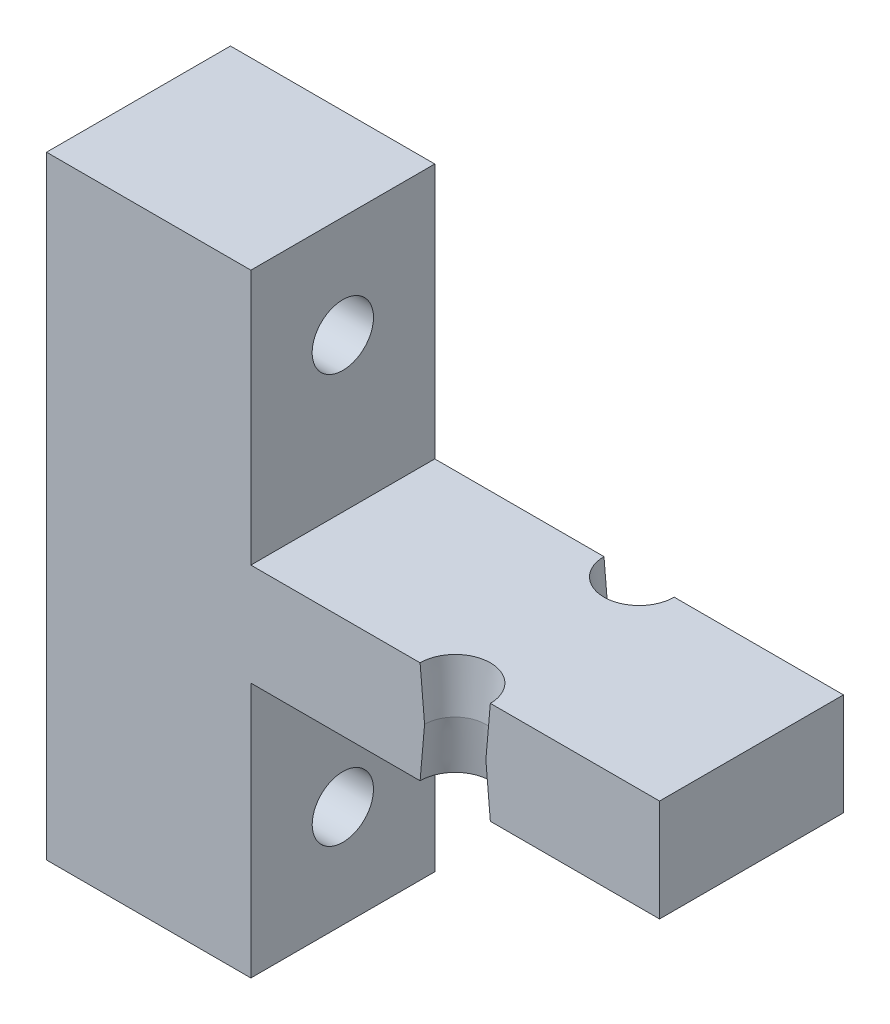
ISO-10303-21;
HEADER;
FILE_DESCRIPTION(('STEP AP214'),'2;1');
FILE_NAME('part.step','',(''),(''),'','','');
FILE_SCHEMA(('AUTOMOTIVE_DESIGN { 1 0 10303 214 1 1 1 1 }'));
ENDSEC;
DATA;
#1=APPLICATION_CONTEXT('core data for automotive mechanical design processes');
#2=APPLICATION_PROTOCOL_DEFINITION('international standard','automotive_design',2000,#1);
#3=PRODUCT_CONTEXT('',#1,'mechanical');
#4=PRODUCT('Part','Part','',(#3));
#5=PRODUCT_RELATED_PRODUCT_CATEGORY('part','',(#4));
#6=PRODUCT_DEFINITION_FORMATION('','',#4);
#7=PRODUCT_DEFINITION_CONTEXT('part definition',#1,'design');
#8=PRODUCT_DEFINITION('design','',#6,#7);
#9=PRODUCT_DEFINITION_SHAPE('','',#8);
#10=(LENGTH_UNIT() NAMED_UNIT(*) SI_UNIT(.MILLI.,.METRE.));
#11=(NAMED_UNIT(*) PLANE_ANGLE_UNIT() SI_UNIT($,.RADIAN.));
#12=(NAMED_UNIT(*) SI_UNIT($,.STERADIAN.) SOLID_ANGLE_UNIT());
#13=UNCERTAINTY_MEASURE_WITH_UNIT(LENGTH_MEASURE(1.E-05),#10,'distance_accuracy_value','');
#14=(GEOMETRIC_REPRESENTATION_CONTEXT(3) GLOBAL_UNCERTAINTY_ASSIGNED_CONTEXT((#13)) GLOBAL_UNIT_ASSIGNED_CONTEXT((#10,
#11,#12)) REPRESENTATION_CONTEXT('',''));
#15=CARTESIAN_POINT('',(0.,0.,0.));
#16=DIRECTION('',(0.,0.,1.));
#17=DIRECTION('',(1.,0.,0.));
#18=AXIS2_PLACEMENT_3D('',#15,#16,#17);
#19=CARTESIAN_POINT('',(0.,30.,9.));
#20=DIRECTION('',(0.,0.,-1.));
#21=DIRECTION('',(-1.,0.,0.));
#22=AXIS2_PLACEMENT_3D('',#19,#20,#21);
#23=PLANE('',#22);
#24=DIRECTION('',(0.0871557427476582,-0.996194698091746,0.));
#25=VECTOR('',#24,1.);
#26=CARTESIAN_POINT('',(20.,32.145078454142,9.));
#27=LINE('',#26,#25);
#28=CARTESIAN_POINT('',(21.7187216588148,12.5,9.00000000000001));
#29=VERTEX_POINT('',#28);
#30=CARTESIAN_POINT('',(21.5,15.,9.00000000000001));
#31=VERTEX_POINT('',#30);
#32=EDGE_CURVE('E141',#29,#31,#27,.F.);
#33=ORIENTED_EDGE('',*,*,#32,.F.);
#34=DIRECTION('',(-1.,0.,0.));
#35=VECTOR('',#34,1.);
#36=CARTESIAN_POINT('',(30.,12.5,9.00000000000001));
#37=LINE('',#36,#35);
#38=CARTESIAN_POINT('',(30.,12.5,9.00000000000001));
#39=VERTEX_POINT('',#38);
#40=EDGE_CURVE('E213',#39,#29,#37,.T.);
#41=ORIENTED_EDGE('',*,*,#40,.F.);
#42=DIRECTION('',(0.,-1.,0.));
#43=VECTOR('',#42,1.);
#44=CARTESIAN_POINT('',(30.,17.5,9.00000000000001));
#45=LINE('',#44,#43);
#46=CARTESIAN_POINT('',(30.,17.5,9.00000000000001));
#47=VERTEX_POINT('',#46);
#48=EDGE_CURVE('E188',#47,#39,#45,.T.);
#49=ORIENTED_EDGE('',*,*,#48,.F.);
#50=DIRECTION('',(-1.,0.,0.));
#51=VECTOR('',#50,1.);
#52=CARTESIAN_POINT('',(30.,17.5,9.00000000000001));
#53=LINE('',#52,#51);
#54=CARTESIAN_POINT('',(21.7187216588148,17.5,9.00000000000001));
#55=VERTEX_POINT('',#54);
#56=EDGE_CURVE('E159',#47,#55,#53,.T.);
#57=ORIENTED_EDGE('',*,*,#56,.T.);
#58=DIRECTION('',(-0.0871557427476582,-0.996194698091746,0.));
#59=VECTOR('',#58,1.);
#60=CARTESIAN_POINT('',(20.,-2.14507845414202,9.));
#61=LINE('',#60,#59);
#62=EDGE_CURVE('E54',#55,#31,#61,.T.);
#63=ORIENTED_EDGE('',*,*,#62,.T.);
#64=EDGE_LOOP('',(#33,#41,#49,#57,#63));
#65=FACE_BOUND('',#64,.T.);
#66=ADVANCED_FACE('F39',(#65),#23,.F.);
#67=DIRECTION('',(0.0871557427476582,0.996194698091746,0.));
#68=VECTOR('',#67,1.);
#69=CARTESIAN_POINT('',(20.,32.145078454142,9.));
#70=LINE('',#69,#68);
#71=CARTESIAN_POINT('',(18.5,15.,9.00000000000001));
#72=VERTEX_POINT('',#71);
#73=CARTESIAN_POINT('',(18.2812783411852,12.5,9.00000000000001));
#74=VERTEX_POINT('',#73);
#75=EDGE_CURVE('E150',#72,#74,#70,.F.);
#76=ORIENTED_EDGE('',*,*,#75,.F.);
#77=DIRECTION('',(-0.0871557427476582,0.996194698091746,0.));
#78=VECTOR('',#77,1.);
#79=CARTESIAN_POINT('',(20.,-2.14507845414202,9.));
#80=LINE('',#79,#78);
#81=CARTESIAN_POINT('',(18.2812783411852,17.5,9.00000000000001));
#82=VERTEX_POINT('',#81);
#83=EDGE_CURVE('E154',#72,#82,#80,.T.);
#84=ORIENTED_EDGE('',*,*,#83,.T.);
#85=CARTESIAN_POINT('',(10.,17.5,9.));
#86=VERTEX_POINT('',#85);
#87=EDGE_CURVE('E198',#82,#86,#53,.T.);
#88=ORIENTED_EDGE('',*,*,#87,.T.);
#89=DIRECTION('',(0.,-1.,0.));
#90=VECTOR('',#89,1.);
#91=CARTESIAN_POINT('',(10.,30.,9.));
#92=LINE('',#91,#90);
#93=CARTESIAN_POINT('',(10.,30.,9.));
#94=VERTEX_POINT('',#93);
#95=EDGE_CURVE('E243',#94,#86,#92,.T.);
#96=ORIENTED_EDGE('',*,*,#95,.F.);
#97=DIRECTION('',(1.,0.,0.));
#98=VECTOR('',#97,1.);
#99=CARTESIAN_POINT('',(0.,30.,9.));
#100=LINE('',#99,#98);
#101=CARTESIAN_POINT('',(0.,30.,9.));
#102=VERTEX_POINT('',#101);
#103=EDGE_CURVE('E219',#102,#94,#100,.T.);
#104=ORIENTED_EDGE('',*,*,#103,.F.);
#105=DIRECTION('',(0.,-1.,0.));
#106=VECTOR('',#105,1.);
#107=CARTESIAN_POINT('',(0.,30.,9.));
#108=LINE('',#107,#106);
#109=CARTESIAN_POINT('',(0.,0.,9.));
#110=VERTEX_POINT('',#109);
#111=EDGE_CURVE('E246',#102,#110,#108,.T.);
#112=ORIENTED_EDGE('',*,*,#111,.T.);
#113=DIRECTION('',(1.,0.,0.));
#114=VECTOR('',#113,1.);
#115=CARTESIAN_POINT('',(0.,0.,9.));
#116=LINE('',#115,#114);
#117=CARTESIAN_POINT('',(10.,0.,9.));
#118=VERTEX_POINT('',#117);
#119=EDGE_CURVE('E229',#110,#118,#116,.T.);
#120=ORIENTED_EDGE('',*,*,#119,.T.);
#121=CARTESIAN_POINT('',(10.,12.5,9.));
#122=VERTEX_POINT('',#121);
#123=EDGE_CURVE('E242',#122,#118,#92,.T.);
#124=ORIENTED_EDGE('',*,*,#123,.F.);
#125=EDGE_CURVE('E212',#74,#122,#37,.T.);
#126=ORIENTED_EDGE('',*,*,#125,.F.);
#127=EDGE_LOOP('',(#76,#84,#88,#96,#104,#112,#120,#124,#126));
#128=FACE_BOUND('',#127,.T.);
#129=ADVANCED_FACE('F258',(#128),#23,.F.);
#130=CARTESIAN_POINT('',(0.,30.,0.));
#131=DIRECTION('',(0.,0.,1.));
#132=DIRECTION('',(1.,0.,0.));
#133=AXIS2_PLACEMENT_3D('',#130,#131,#132);
#134=PLANE('',#133);
#135=DIRECTION('',(0.0871557427476582,-0.996194698091746,0.));
#136=VECTOR('',#135,1.);
#137=CARTESIAN_POINT('',(20.,-2.14507845414202,0.));
#138=LINE('',#137,#136);
#139=CARTESIAN_POINT('',(18.5,15.,0.));
#140=VERTEX_POINT('',#139);
#141=CARTESIAN_POINT('',(18.2812783411852,17.5,0.));
#142=VERTEX_POINT('',#141);
#143=EDGE_CURVE('E62',#140,#142,#138,.F.);
#144=ORIENTED_EDGE('',*,*,#143,.F.);
#145=DIRECTION('',(-0.0871557427476582,-0.996194698091746,0.));
#146=VECTOR('',#145,1.);
#147=CARTESIAN_POINT('',(20.,32.145078454142,0.));
#148=LINE('',#147,#146);
#149=CARTESIAN_POINT('',(18.2812783411852,12.5,0.));
#150=VERTEX_POINT('',#149);
#151=EDGE_CURVE('E172',#140,#150,#148,.T.);
#152=ORIENTED_EDGE('',*,*,#151,.T.);
#153=DIRECTION('',(-1.,0.,0.));
#154=VECTOR('',#153,1.);
#155=CARTESIAN_POINT('',(30.,12.5,0.));
#156=LINE('',#155,#154);
#157=CARTESIAN_POINT('',(10.,12.5,0.));
#158=VERTEX_POINT('',#157);
#159=EDGE_CURVE('E208',#150,#158,#156,.T.);
#160=ORIENTED_EDGE('',*,*,#159,.T.);
#161=DIRECTION('',(0.,-1.,0.));
#162=VECTOR('',#161,1.);
#163=CARTESIAN_POINT('',(10.,30.,0.));
#164=LINE('',#163,#162);
#165=CARTESIAN_POINT('',(10.,0.,0.));
#166=VERTEX_POINT('',#165);
#167=EDGE_CURVE('E238',#158,#166,#164,.T.);
#168=ORIENTED_EDGE('',*,*,#167,.T.);
#169=DIRECTION('',(-1.,0.,0.));
#170=VECTOR('',#169,1.);
#171=CARTESIAN_POINT('',(0.,0.,0.));
#172=LINE('',#171,#170);
#173=CARTESIAN_POINT('',(0.,0.,0.));
#174=VERTEX_POINT('',#173);
#175=EDGE_CURVE('E220',#166,#174,#172,.T.);
#176=ORIENTED_EDGE('',*,*,#175,.T.);
#177=DIRECTION('',(0.,-1.,0.));
#178=VECTOR('',#177,1.);
#179=CARTESIAN_POINT('',(0.,30.,0.));
#180=LINE('',#179,#178);
#181=CARTESIAN_POINT('',(0.,30.,0.));
#182=VERTEX_POINT('',#181);
#183=EDGE_CURVE('E226',#182,#174,#180,.T.);
#184=ORIENTED_EDGE('',*,*,#183,.F.);
#185=DIRECTION('',(-1.,0.,0.));
#186=VECTOR('',#185,1.);
#187=CARTESIAN_POINT('',(0.,30.,0.));
#188=LINE('',#187,#186);
#189=CARTESIAN_POINT('',(10.,30.,0.));
#190=VERTEX_POINT('',#189);
#191=EDGE_CURVE('E224',#190,#182,#188,.T.);
#192=ORIENTED_EDGE('',*,*,#191,.F.);
#193=CARTESIAN_POINT('',(10.,17.5,0.));
#194=VERTEX_POINT('',#193);
#195=EDGE_CURVE('E239',#190,#194,#164,.T.);
#196=ORIENTED_EDGE('',*,*,#195,.T.);
#197=DIRECTION('',(-1.,0.,0.));
#198=VECTOR('',#197,1.);
#199=CARTESIAN_POINT('',(30.,17.5,0.));
#200=LINE('',#199,#198);
#201=EDGE_CURVE('E204',#142,#194,#200,.T.);
#202=ORIENTED_EDGE('',*,*,#201,.F.);
#203=EDGE_LOOP('',(#144,#152,#160,#168,#176,#184,#192,#196,#202));
#204=FACE_BOUND('',#203,.T.);
#205=ADVANCED_FACE('F279',(#204),#134,.F.);
#206=CARTESIAN_POINT('',(30.,12.5,0.));
#207=VERTEX_POINT('',#206);
#208=CARTESIAN_POINT('',(21.7187216588148,12.5,0.));
#209=VERTEX_POINT('',#208);
#210=EDGE_CURVE('E209',#207,#209,#156,.T.);
#211=ORIENTED_EDGE('',*,*,#210,.T.);
#212=DIRECTION('',(-0.0871557427476582,0.996194698091746,0.));
#213=VECTOR('',#212,1.);
#214=CARTESIAN_POINT('',(20.,32.145078454142,0.));
#215=LINE('',#214,#213);
#216=CARTESIAN_POINT('',(21.5,15.,0.));
#217=VERTEX_POINT('',#216);
#218=EDGE_CURVE('E169',#209,#217,#215,.T.);
#219=ORIENTED_EDGE('',*,*,#218,.T.);
#220=DIRECTION('',(0.0871557427476582,0.996194698091746,0.));
#221=VECTOR('',#220,1.);
#222=CARTESIAN_POINT('',(20.,-2.14507845414202,0.));
#223=LINE('',#222,#221);
#224=CARTESIAN_POINT('',(21.7187216588148,17.5,0.));
#225=VERTEX_POINT('',#224);
#226=EDGE_CURVE('E167',#225,#217,#223,.F.);
#227=ORIENTED_EDGE('',*,*,#226,.F.);
#228=CARTESIAN_POINT('',(30.,17.5,0.));
#229=VERTEX_POINT('',#228);
#230=EDGE_CURVE('E205',#229,#225,#200,.T.);
#231=ORIENTED_EDGE('',*,*,#230,.F.);
#232=DIRECTION('',(0.,1.,0.));
#233=VECTOR('',#232,1.);
#234=CARTESIAN_POINT('',(30.,17.5,0.));
#235=LINE('',#234,#233);
#236=EDGE_CURVE('E194',#207,#229,#235,.T.);
#237=ORIENTED_EDGE('',*,*,#236,.F.);
#238=EDGE_LOOP('',(#211,#219,#227,#231,#237));
#239=FACE_BOUND('',#238,.T.);
#240=ADVANCED_FACE('F273',(#239),#134,.F.);
#241=CARTESIAN_POINT('',(10.,30.,0.));
#242=DIRECTION('',(-1.,0.,0.));
#243=DIRECTION('',(0.,0.,1.));
#244=AXIS2_PLACEMENT_3D('',#241,#242,#243);
#245=PLANE('',#244);
#246=CARTESIAN_POINT('',(10.,25.,4.5));
#247=DIRECTION('',(1.,0.,0.));
#248=DIRECTION('',(0.,0.,-1.));
#249=AXIS2_PLACEMENT_3D('',#246,#247,#248);
#250=CIRCLE('',#249,1.5);
#251=CARTESIAN_POINT('',(10.,25.,3.));
#252=VERTEX_POINT('',#251);
#253=EDGE_CURVE('E180',#252,#252,#250,.T.);
#254=ORIENTED_EDGE('',*,*,#253,.F.);
#255=EDGE_LOOP('',(#254));
#256=FACE_BOUND('',#255,.T.);
#257=DIRECTION('',(0.,0.,1.));
#258=VECTOR('',#257,1.);
#259=CARTESIAN_POINT('',(10.,17.5,9.));
#260=LINE('',#259,#258);
#261=EDGE_CURVE('E192',#194,#86,#260,.T.);
#262=ORIENTED_EDGE('',*,*,#261,.F.);
#263=ORIENTED_EDGE('',*,*,#195,.F.);
#264=DIRECTION('',(0.,0.,-1.));
#265=VECTOR('',#264,1.);
#266=CARTESIAN_POINT('',(10.,30.,0.));
#267=LINE('',#266,#265);
#268=EDGE_CURVE('E222',#94,#190,#267,.T.);
#269=ORIENTED_EDGE('',*,*,#268,.F.);
#270=ORIENTED_EDGE('',*,*,#95,.T.);
#271=EDGE_LOOP('',(#262,#263,#269,#270));
#272=FACE_BOUND('',#271,.T.);
#273=ADVANCED_FACE('F299',(#256,#272),#245,.F.);
#274=CARTESIAN_POINT('',(10.,5.,4.5));
#275=DIRECTION('',(1.,0.,0.));
#276=DIRECTION('',(0.,0.,1.));
#277=AXIS2_PLACEMENT_3D('',#274,#275,#276);
#278=CIRCLE('',#277,1.5);
#279=CARTESIAN_POINT('',(10.,5.,6.));
#280=VERTEX_POINT('',#279);
#281=EDGE_CURVE('E183',#280,#280,#278,.T.);
#282=ORIENTED_EDGE('',*,*,#281,.F.);
#283=EDGE_LOOP('',(#282));
#284=FACE_BOUND('',#283,.T.);
#285=DIRECTION('',(0.,0.,-1.));
#286=VECTOR('',#285,1.);
#287=CARTESIAN_POINT('',(10.,12.5,9.));
#288=LINE('',#287,#286);
#289=EDGE_CURVE('E179',#122,#158,#288,.T.);
#290=ORIENTED_EDGE('',*,*,#289,.F.);
#291=ORIENTED_EDGE('',*,*,#123,.T.);
#292=DIRECTION('',(0.,0.,-1.));
#293=VECTOR('',#292,1.);
#294=CARTESIAN_POINT('',(10.,0.,0.));
#295=LINE('',#294,#293);
#296=EDGE_CURVE('E232',#118,#166,#295,.T.);
#297=ORIENTED_EDGE('',*,*,#296,.T.);
#298=ORIENTED_EDGE('',*,*,#167,.F.);
#299=EDGE_LOOP('',(#290,#291,#297,#298));
#300=FACE_BOUND('',#299,.T.);
#301=ADVANCED_FACE('F282',(#284,#300),#245,.F.);
#302=CARTESIAN_POINT('',(0.,30.,0.));
#303=DIRECTION('',(1.,0.,0.));
#304=DIRECTION('',(0.,0.,-1.));
#305=AXIS2_PLACEMENT_3D('',#302,#303,#304);
#306=PLANE('',#305);
#307=CARTESIAN_POINT('',(0.,25.,4.5));
#308=DIRECTION('',(1.,0.,0.));
#309=DIRECTION('',(0.,0.,-1.));
#310=AXIS2_PLACEMENT_3D('',#307,#308,#309);
#311=CIRCLE('',#310,1.5);
#312=CARTESIAN_POINT('',(0.,25.,2.99999999999999));
#313=VERTEX_POINT('',#312);
#314=EDGE_CURVE('E176',#313,#313,#311,.T.);
#315=ORIENTED_EDGE('',*,*,#314,.T.);
#316=EDGE_LOOP('',(#315));
#317=FACE_BOUND('',#316,.T.);
#318=CARTESIAN_POINT('',(0.,5.,4.5));
#319=DIRECTION('',(1.,0.,0.));
#320=DIRECTION('',(0.,0.,1.));
#321=AXIS2_PLACEMENT_3D('',#318,#319,#320);
#322=CIRCLE('',#321,1.5);
#323=CARTESIAN_POINT('',(0.,5.,6.));
#324=VERTEX_POINT('',#323);
#325=EDGE_CURVE('E175',#324,#324,#322,.T.);
#326=ORIENTED_EDGE('',*,*,#325,.T.);
#327=EDGE_LOOP('',(#326));
#328=FACE_BOUND('',#327,.T.);
#329=DIRECTION('',(0.,0.,1.));
#330=VECTOR('',#329,1.);
#331=CARTESIAN_POINT('',(0.,0.,0.));
#332=LINE('',#331,#330);
#333=EDGE_CURVE('E215',#174,#110,#332,.T.);
#334=ORIENTED_EDGE('',*,*,#333,.T.);
#335=ORIENTED_EDGE('',*,*,#111,.F.);
#336=DIRECTION('',(0.,0.,1.));
#337=VECTOR('',#336,1.);
#338=CARTESIAN_POINT('',(0.,30.,0.));
#339=LINE('',#338,#337);
#340=EDGE_CURVE('E216',#182,#102,#339,.T.);
#341=ORIENTED_EDGE('',*,*,#340,.F.);
#342=ORIENTED_EDGE('',*,*,#183,.T.);
#343=EDGE_LOOP('',(#334,#335,#341,#342));
#344=FACE_BOUND('',#343,.T.);
#345=ADVANCED_FACE('F41',(#317,#328,#344),#306,.F.);
#346=CARTESIAN_POINT('',(0.,30.,0.));
#347=DIRECTION('',(0.,1.,0.));
#348=DIRECTION('',(0.,0.,1.));
#349=AXIS2_PLACEMENT_3D('',#346,#347,#348);
#350=PLANE('',#349);
#351=ORIENTED_EDGE('',*,*,#340,.T.);
#352=ORIENTED_EDGE('',*,*,#103,.T.);
#353=ORIENTED_EDGE('',*,*,#268,.T.);
#354=ORIENTED_EDGE('',*,*,#191,.T.);
#355=EDGE_LOOP('',(#351,#352,#353,#354));
#356=FACE_BOUND('',#355,.T.);
#357=ADVANCED_FACE('F294',(#356),#350,.T.);
#358=CARTESIAN_POINT('',(0.,0.,0.));
#359=DIRECTION('',(0.,1.,0.));
#360=DIRECTION('',(0.,0.,1.));
#361=AXIS2_PLACEMENT_3D('',#358,#359,#360);
#362=PLANE('',#361);
#363=ORIENTED_EDGE('',*,*,#333,.F.);
#364=ORIENTED_EDGE('',*,*,#175,.F.);
#365=ORIENTED_EDGE('',*,*,#296,.F.);
#366=ORIENTED_EDGE('',*,*,#119,.F.);
#367=EDGE_LOOP('',(#363,#364,#365,#366));
#368=FACE_BOUND('',#367,.T.);
#369=ADVANCED_FACE('F288',(#368),#362,.F.);
#370=CARTESIAN_POINT('',(30.,12.5,9.00000000000001));
#371=DIRECTION('',(0.,1.,0.));
#372=DIRECTION('',(0.,0.,1.));
#373=AXIS2_PLACEMENT_3D('',#370,#371,#372);
#374=PLANE('',#373);
#375=CARTESIAN_POINT('',(20.,12.5,9.00000000000001));
#376=DIRECTION('',(0.,1.,0.));
#377=DIRECTION('',(0.,0.,1.));
#378=AXIS2_PLACEMENT_3D('',#375,#376,#377);
#379=CIRCLE('',#378,1.71872165881481);
#380=EDGE_CURVE('E11',#74,#29,#379,.F.);
#381=ORIENTED_EDGE('',*,*,#380,.F.);
#382=ORIENTED_EDGE('',*,*,#125,.T.);
#383=ORIENTED_EDGE('',*,*,#289,.T.);
#384=ORIENTED_EDGE('',*,*,#159,.F.);
#385=CARTESIAN_POINT('',(20.,12.5,0.));
#386=DIRECTION('',(0.,1.,0.));
#387=DIRECTION('',(0.,0.,1.));
#388=AXIS2_PLACEMENT_3D('',#385,#386,#387);
#389=CIRCLE('',#388,1.71872165881481);
#390=EDGE_CURVE('E251',#150,#209,#389,.T.);
#391=ORIENTED_EDGE('',*,*,#390,.T.);
#392=ORIENTED_EDGE('',*,*,#210,.F.);
#393=DIRECTION('',(0.,0.,-1.));
#394=VECTOR('',#393,1.);
#395=CARTESIAN_POINT('',(30.,12.5,9.00000000000001));
#396=LINE('',#395,#394);
#397=EDGE_CURVE('E191',#39,#207,#396,.T.);
#398=ORIENTED_EDGE('',*,*,#397,.F.);
#399=ORIENTED_EDGE('',*,*,#40,.T.);
#400=EDGE_LOOP('',(#381,#382,#383,#384,#391,#392,#398,#399));
#401=FACE_BOUND('',#400,.T.);
#402=ADVANCED_FACE('F263',(#401),#374,.F.);
#403=CARTESIAN_POINT('',(30.,17.5,9.00000000000001));
#404=DIRECTION('',(0.,-1.,0.));
#405=DIRECTION('',(0.,0.,-1.));
#406=AXIS2_PLACEMENT_3D('',#403,#404,#405);
#407=PLANE('',#406);
#408=ORIENTED_EDGE('',*,*,#87,.F.);
#409=CARTESIAN_POINT('',(20.,17.5,9.00000000000001));
#410=DIRECTION('',(0.,-1.,0.));
#411=DIRECTION('',(0.,0.,-1.));
#412=AXIS2_PLACEMENT_3D('',#409,#410,#411);
#413=CIRCLE('',#412,1.71872165881481);
#414=EDGE_CURVE('E47',#82,#55,#413,.T.);
#415=ORIENTED_EDGE('',*,*,#414,.T.);
#416=ORIENTED_EDGE('',*,*,#56,.F.);
#417=DIRECTION('',(0.,0.,1.));
#418=VECTOR('',#417,1.);
#419=CARTESIAN_POINT('',(30.,17.5,9.00000000000001));
#420=LINE('',#419,#418);
#421=EDGE_CURVE('E196',#229,#47,#420,.T.);
#422=ORIENTED_EDGE('',*,*,#421,.F.);
#423=ORIENTED_EDGE('',*,*,#230,.T.);
#424=CARTESIAN_POINT('',(20.,17.5,0.));
#425=DIRECTION('',(0.,-1.,0.));
#426=DIRECTION('',(0.,0.,-1.));
#427=AXIS2_PLACEMENT_3D('',#424,#425,#426);
#428=CIRCLE('',#427,1.71872165881481);
#429=EDGE_CURVE('E249',#142,#225,#428,.F.);
#430=ORIENTED_EDGE('',*,*,#429,.F.);
#431=ORIENTED_EDGE('',*,*,#201,.T.);
#432=ORIENTED_EDGE('',*,*,#261,.T.);
#433=EDGE_LOOP('',(#408,#415,#416,#422,#423,#430,#431,#432));
#434=FACE_BOUND('',#433,.T.);
#435=ADVANCED_FACE('F255',(#434),#407,.F.);
#436=CARTESIAN_POINT('',(30.,0.,0.));
#437=DIRECTION('',(1.,0.,0.));
#438=DIRECTION('',(0.,0.,-1.));
#439=AXIS2_PLACEMENT_3D('',#436,#437,#438);
#440=PLANE('',#439);
#441=ORIENTED_EDGE('',*,*,#48,.T.);
#442=ORIENTED_EDGE('',*,*,#397,.T.);
#443=ORIENTED_EDGE('',*,*,#236,.T.);
#444=ORIENTED_EDGE('',*,*,#421,.T.);
#445=EDGE_LOOP('',(#441,#442,#443,#444));
#446=FACE_BOUND('',#445,.T.);
#447=ADVANCED_FACE('F267',(#446),#440,.T.);
#448=CARTESIAN_POINT('',(0.,5.,4.5));
#449=DIRECTION('',(1.,0.,0.));
#450=DIRECTION('',(0.,0.,-1.));
#451=AXIS2_PLACEMENT_3D('',#448,#449,#450);
#452=CYLINDRICAL_SURFACE('',#451,1.5);
#453=ORIENTED_EDGE('',*,*,#325,.F.);
#454=EDGE_LOOP('',(#453));
#455=FACE_BOUND('',#454,.T.);
#456=ORIENTED_EDGE('',*,*,#281,.T.);
#457=EDGE_LOOP('',(#456));
#458=FACE_BOUND('',#457,.T.);
#459=ADVANCED_FACE('F330',(#455,#458),#452,.F.);
#460=CARTESIAN_POINT('',(0.,25.,4.5));
#461=DIRECTION('',(1.,0.,0.));
#462=DIRECTION('',(0.,0.,-1.));
#463=AXIS2_PLACEMENT_3D('',#460,#461,#462);
#464=CYLINDRICAL_SURFACE('',#463,1.5);
#465=ORIENTED_EDGE('',*,*,#314,.F.);
#466=EDGE_LOOP('',(#465));
#467=FACE_BOUND('',#466,.T.);
#468=ORIENTED_EDGE('',*,*,#253,.T.);
#469=EDGE_LOOP('',(#468));
#470=FACE_BOUND('',#469,.T.);
#471=ADVANCED_FACE('F333',(#467,#470),#464,.F.);
#472=CARTESIAN_POINT('',(20.,15.,0.));
#473=DIRECTION('',(0.,-1.,0.));
#474=DIRECTION('',(0.,0.,1.));
#475=AXIS2_PLACEMENT_3D('',#472,#473,#474);
#476=CONICAL_SURFACE('',#475,1.5,0.0872664625997165);
#477=CARTESIAN_POINT('',(20.,15.,0.));
#478=DIRECTION('',(0.,1.,0.));
#479=DIRECTION('',(0.,0.,1.));
#480=AXIS2_PLACEMENT_3D('',#477,#478,#479);
#481=CIRCLE('',#480,1.5);
#482=EDGE_CURVE('E149',#140,#217,#481,.T.);
#483=ORIENTED_EDGE('',*,*,#482,.T.);
#484=ORIENTED_EDGE('',*,*,#218,.F.);
#485=ORIENTED_EDGE('',*,*,#390,.F.);
#486=ORIENTED_EDGE('',*,*,#151,.F.);
#487=EDGE_LOOP('',(#483,#484,#485,#486));
#488=FACE_BOUND('',#487,.T.);
#489=ADVANCED_FACE('F276',(#488),#476,.F.);
#490=CARTESIAN_POINT('',(20.,15.,0.));
#491=DIRECTION('',(0.,1.,0.));
#492=DIRECTION('',(0.,0.,1.));
#493=AXIS2_PLACEMENT_3D('',#490,#491,#492);
#494=CONICAL_SURFACE('',#493,1.5,0.0872664625997165);
#495=ORIENTED_EDGE('',*,*,#226,.T.);
#496=ORIENTED_EDGE('',*,*,#482,.F.);
#497=ORIENTED_EDGE('',*,*,#143,.T.);
#498=ORIENTED_EDGE('',*,*,#429,.T.);
#499=EDGE_LOOP('',(#495,#496,#497,#498));
#500=FACE_BOUND('',#499,.T.);
#501=ADVANCED_FACE('F274',(#500),#494,.F.);
#502=CARTESIAN_POINT('',(20.,15.,9.00000000000001));
#503=DIRECTION('',(0.,-1.,0.));
#504=DIRECTION('',(0.,0.,-1.));
#505=AXIS2_PLACEMENT_3D('',#502,#503,#504);
#506=CONICAL_SURFACE('',#505,1.5,0.0872664625997165);
#507=ORIENTED_EDGE('',*,*,#32,.T.);
#508=CARTESIAN_POINT('',(20.,15.,9.00000000000001));
#509=DIRECTION('',(0.,-1.,0.));
#510=DIRECTION('',(0.,0.,-1.));
#511=AXIS2_PLACEMENT_3D('',#508,#509,#510);
#512=CIRCLE('',#511,1.5);
#513=EDGE_CURVE('E143',#72,#31,#512,.T.);
#514=ORIENTED_EDGE('',*,*,#513,.F.);
#515=ORIENTED_EDGE('',*,*,#75,.T.);
#516=ORIENTED_EDGE('',*,*,#380,.T.);
#517=EDGE_LOOP('',(#507,#514,#515,#516));
#518=FACE_BOUND('',#517,.T.);
#519=ADVANCED_FACE('F142',(#518),#506,.F.);
#520=CARTESIAN_POINT('',(20.,15.,9.00000000000001));
#521=DIRECTION('',(0.,1.,0.));
#522=DIRECTION('',(0.,0.,-1.));
#523=AXIS2_PLACEMENT_3D('',#520,#521,#522);
#524=CONICAL_SURFACE('',#523,1.5,0.0872664625997165);
#525=ORIENTED_EDGE('',*,*,#513,.T.);
#526=ORIENTED_EDGE('',*,*,#62,.F.);
#527=ORIENTED_EDGE('',*,*,#414,.F.);
#528=ORIENTED_EDGE('',*,*,#83,.F.);
#529=EDGE_LOOP('',(#525,#526,#527,#528));
#530=FACE_BOUND('',#529,.T.);
#531=ADVANCED_FACE('F152',(#530),#524,.F.);
#532=CLOSED_SHELL('',(#66,#129,#205,#240,#273,#301,#345,#357,#369,#402,#435,#447,#459,#471,#489,
#501,#519,#531));
#533=MANIFOLD_SOLID_BREP('B2',#532);
#534=ADVANCED_BREP_SHAPE_REPRESENTATION('',(#18,#533),#14);
#535=SHAPE_DEFINITION_REPRESENTATION(#9,#534);
ENDSEC;
END-ISO-10303-21;
